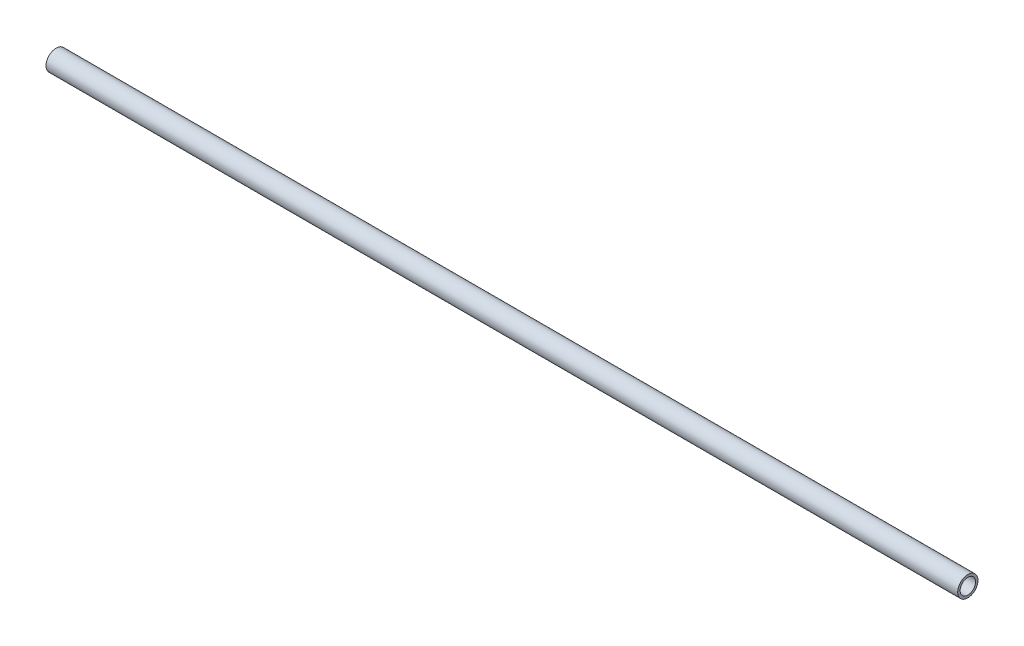
ISO-10303-21;
HEADER;
FILE_DESCRIPTION(('STEP AP214'),'2;1');
FILE_NAME('part.step','',(''),(''),'','','');
FILE_SCHEMA(('AUTOMOTIVE_DESIGN { 1 0 10303 214 1 1 1 1 }'));
ENDSEC;
DATA;
#1=APPLICATION_CONTEXT('core data for automotive mechanical design processes');
#2=APPLICATION_PROTOCOL_DEFINITION('international standard','automotive_design',2000,#1);
#3=PRODUCT_CONTEXT('',#1,'mechanical');
#4=PRODUCT('Part','Part','',(#3));
#5=PRODUCT_RELATED_PRODUCT_CATEGORY('part','',(#4));
#6=PRODUCT_DEFINITION_FORMATION('','',#4);
#7=PRODUCT_DEFINITION_CONTEXT('part definition',#1,'design');
#8=PRODUCT_DEFINITION('design','',#6,#7);
#9=PRODUCT_DEFINITION_SHAPE('','',#8);
#10=(LENGTH_UNIT() NAMED_UNIT(*) SI_UNIT(.MILLI.,.METRE.));
#11=(NAMED_UNIT(*) PLANE_ANGLE_UNIT() SI_UNIT($,.RADIAN.));
#12=(NAMED_UNIT(*) SI_UNIT($,.STERADIAN.) SOLID_ANGLE_UNIT());
#13=UNCERTAINTY_MEASURE_WITH_UNIT(LENGTH_MEASURE(1.E-05),#10,'distance_accuracy_value','');
#14=(GEOMETRIC_REPRESENTATION_CONTEXT(3) GLOBAL_UNCERTAINTY_ASSIGNED_CONTEXT((#13)) GLOBAL_UNIT_ASSIGNED_CONTEXT((#10,
#11,#12)) REPRESENTATION_CONTEXT('',''));
#15=CARTESIAN_POINT('',(0.,0.,0.));
#16=DIRECTION('',(0.,0.,1.));
#17=DIRECTION('',(1.,0.,0.));
#18=AXIS2_PLACEMENT_3D('',#15,#16,#17);
#19=CARTESIAN_POINT('',(1140.,0.,0.));
#20=DIRECTION('',(1.,0.,0.));
#21=DIRECTION('',(0.,0.,-1.));
#22=AXIS2_PLACEMENT_3D('',#19,#20,#21);
#23=PLANE('',#22);
#24=CARTESIAN_POINT('',(1140.,0.,0.));
#25=DIRECTION('',(1.,0.,0.));
#26=DIRECTION('',(0.,0.,-1.));
#27=AXIS2_PLACEMENT_3D('',#24,#25,#26);
#28=CIRCLE('',#27,12.7);
#29=CARTESIAN_POINT('',(1140.,0.,-12.7));
#30=VERTEX_POINT('',#29);
#31=EDGE_CURVE('E10',#30,#30,#28,.T.);
#32=ORIENTED_EDGE('',*,*,#31,.T.);
#33=EDGE_LOOP('',(#32));
#34=FACE_BOUND('',#33,.T.);
#35=CARTESIAN_POINT('',(1140.,0.,0.));
#36=DIRECTION('',(1.,0.,0.));
#37=DIRECTION('',(0.,0.,-1.));
#38=AXIS2_PLACEMENT_3D('',#35,#36,#37);
#39=CIRCLE('',#38,9.652);
#40=CARTESIAN_POINT('',(1140.,0.,-9.652));
#41=VERTEX_POINT('',#40);
#42=EDGE_CURVE('E45',#41,#41,#39,.T.);
#43=ORIENTED_EDGE('',*,*,#42,.F.);
#44=EDGE_LOOP('',(#43));
#45=FACE_BOUND('',#44,.T.);
#46=ADVANCED_FACE('F34',(#34,#45),#23,.T.);
#47=CARTESIAN_POINT('',(0.,0.,0.));
#48=DIRECTION('',(1.,0.,0.));
#49=DIRECTION('',(0.,0.,-1.));
#50=AXIS2_PLACEMENT_3D('',#47,#48,#49);
#51=PLANE('',#50);
#52=CARTESIAN_POINT('',(0.,0.,0.));
#53=DIRECTION('',(1.,0.,0.));
#54=DIRECTION('',(0.,0.,-1.));
#55=AXIS2_PLACEMENT_3D('',#52,#53,#54);
#56=CIRCLE('',#55,12.7);
#57=CARTESIAN_POINT('',(0.,0.,-12.7));
#58=VERTEX_POINT('',#57);
#59=EDGE_CURVE('E38',#58,#58,#56,.T.);
#60=ORIENTED_EDGE('',*,*,#59,.F.);
#61=EDGE_LOOP('',(#60));
#62=FACE_BOUND('',#61,.T.);
#63=CARTESIAN_POINT('',(0.,0.,0.));
#64=DIRECTION('',(1.,0.,0.));
#65=DIRECTION('',(0.,0.,-1.));
#66=AXIS2_PLACEMENT_3D('',#63,#64,#65);
#67=CIRCLE('',#66,9.652);
#68=CARTESIAN_POINT('',(0.,0.,-9.652));
#69=VERTEX_POINT('',#68);
#70=EDGE_CURVE('E47',#69,#69,#67,.T.);
#71=ORIENTED_EDGE('',*,*,#70,.T.);
#72=EDGE_LOOP('',(#71));
#73=FACE_BOUND('',#72,.T.);
#74=ADVANCED_FACE('F57',(#62,#73),#51,.F.);
#75=CARTESIAN_POINT('',(1140.,0.,0.));
#76=DIRECTION('',(-1.,0.,0.));
#77=DIRECTION('',(0.,0.,1.));
#78=AXIS2_PLACEMENT_3D('',#75,#76,#77);
#79=CYLINDRICAL_SURFACE('',#78,12.7);
#80=ORIENTED_EDGE('',*,*,#31,.F.);
#81=EDGE_LOOP('',(#80));
#82=FACE_BOUND('',#81,.T.);
#83=ORIENTED_EDGE('',*,*,#59,.T.);
#84=EDGE_LOOP('',(#83));
#85=FACE_BOUND('',#84,.T.);
#86=ADVANCED_FACE('F36',(#82,#85),#79,.T.);
#87=CARTESIAN_POINT('',(1140.,0.,0.));
#88=DIRECTION('',(-1.,0.,0.));
#89=DIRECTION('',(0.,0.,1.));
#90=AXIS2_PLACEMENT_3D('',#87,#88,#89);
#91=CYLINDRICAL_SURFACE('',#90,9.652);
#92=ORIENTED_EDGE('',*,*,#42,.T.);
#93=EDGE_LOOP('',(#92));
#94=FACE_BOUND('',#93,.T.);
#95=ORIENTED_EDGE('',*,*,#70,.F.);
#96=EDGE_LOOP('',(#95));
#97=FACE_BOUND('',#96,.T.);
#98=ADVANCED_FACE('F53',(#94,#97),#91,.F.);
#99=CLOSED_SHELL('',(#46,#74,#86,#98));
#100=MANIFOLD_SOLID_BREP('B2',#99);
#101=ADVANCED_BREP_SHAPE_REPRESENTATION('',(#18,#100),#14);
#102=SHAPE_DEFINITION_REPRESENTATION(#9,#101);
ENDSEC;
END-ISO-10303-21;
